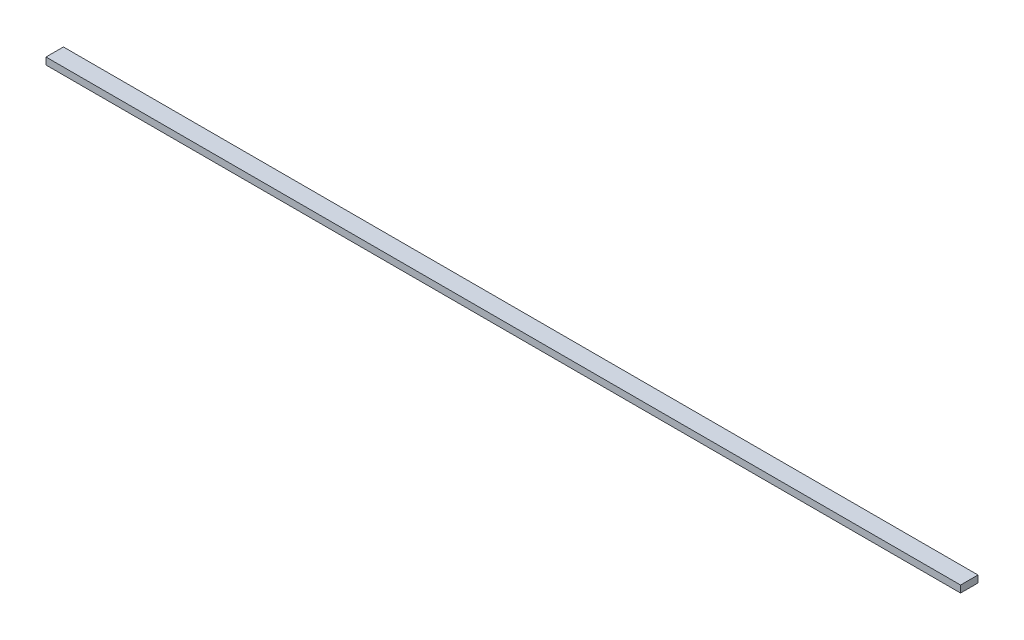
ISO-10303-21;
HEADER;
FILE_DESCRIPTION(('STEP AP214'),'2;1');
FILE_NAME('part.step','',(''),(''),'','','');
FILE_SCHEMA(('AUTOMOTIVE_DESIGN { 1 0 10303 214 1 1 1 1 }'));
ENDSEC;
DATA;
#1=APPLICATION_CONTEXT('core data for automotive mechanical design processes');
#2=APPLICATION_PROTOCOL_DEFINITION('international standard','automotive_design',2000,#1);
#3=PRODUCT_CONTEXT('',#1,'mechanical');
#4=PRODUCT('Part','Part','',(#3));
#5=PRODUCT_RELATED_PRODUCT_CATEGORY('part','',(#4));
#6=PRODUCT_DEFINITION_FORMATION('','',#4);
#7=PRODUCT_DEFINITION_CONTEXT('part definition',#1,'design');
#8=PRODUCT_DEFINITION('design','',#6,#7);
#9=PRODUCT_DEFINITION_SHAPE('','',#8);
#10=(LENGTH_UNIT() NAMED_UNIT(*) SI_UNIT(.MILLI.,.METRE.));
#11=(NAMED_UNIT(*) PLANE_ANGLE_UNIT() SI_UNIT($,.RADIAN.));
#12=(NAMED_UNIT(*) SI_UNIT($,.STERADIAN.) SOLID_ANGLE_UNIT());
#13=UNCERTAINTY_MEASURE_WITH_UNIT(LENGTH_MEASURE(1.E-05),#10,'distance_accuracy_value','');
#14=(GEOMETRIC_REPRESENTATION_CONTEXT(3) GLOBAL_UNCERTAINTY_ASSIGNED_CONTEXT((#13)) GLOBAL_UNIT_ASSIGNED_CONTEXT((#10,
#11,#12)) REPRESENTATION_CONTEXT('',''));
#15=CARTESIAN_POINT('',(0.,0.,0.));
#16=DIRECTION('',(0.,0.,1.));
#17=DIRECTION('',(1.,0.,0.));
#18=AXIS2_PLACEMENT_3D('',#15,#16,#17);
#19=CARTESIAN_POINT('',(10500.,0.,0.));
#20=DIRECTION('',(0.,0.,-1.));
#21=DIRECTION('',(0.,1.,0.));
#22=AXIS2_PLACEMENT_3D('',#19,#20,#21);
#23=PLANE('',#22);
#24=DIRECTION('',(0.,-1.,0.));
#25=VECTOR('',#24,1.);
#26=CARTESIAN_POINT('',(0.,0.,0.));
#27=LINE('',#26,#25);
#28=CARTESIAN_POINT('',(0.,0.,0.));
#29=VERTEX_POINT('',#28);
#30=CARTESIAN_POINT('',(0.,-80.,0.));
#31=VERTEX_POINT('',#30);
#32=EDGE_CURVE('E97',#29,#31,#27,.T.);
#33=ORIENTED_EDGE('',*,*,#32,.T.);
#34=DIRECTION('',(-1.,0.,0.));
#35=VECTOR('',#34,1.);
#36=CARTESIAN_POINT('',(10500.,-80.,0.));
#37=LINE('',#36,#35);
#38=CARTESIAN_POINT('',(10500.,-80.,0.));
#39=VERTEX_POINT('',#38);
#40=EDGE_CURVE('E11',#39,#31,#37,.T.);
#41=ORIENTED_EDGE('',*,*,#40,.F.);
#42=DIRECTION('',(0.,-1.,0.));
#43=VECTOR('',#42,1.);
#44=CARTESIAN_POINT('',(10500.,0.,0.));
#45=LINE('',#44,#43);
#46=CARTESIAN_POINT('',(10500.,0.,0.));
#47=VERTEX_POINT('',#46);
#48=EDGE_CURVE('E85',#47,#39,#45,.T.);
#49=ORIENTED_EDGE('',*,*,#48,.F.);
#50=DIRECTION('',(-1.,0.,0.));
#51=VECTOR('',#50,1.);
#52=CARTESIAN_POINT('',(10500.,0.,0.));
#53=LINE('',#52,#51);
#54=EDGE_CURVE('E93',#47,#29,#53,.T.);
#55=ORIENTED_EDGE('',*,*,#54,.T.);
#56=EDGE_LOOP('',(#33,#41,#49,#55));
#57=FACE_BOUND('',#56,.T.);
#58=ADVANCED_FACE('F34',(#57),#23,.F.);
#59=CARTESIAN_POINT('',(10500.,-80.,0.));
#60=DIRECTION('',(0.,1.,0.));
#61=DIRECTION('',(0.,0.,1.));
#62=AXIS2_PLACEMENT_3D('',#59,#60,#61);
#63=PLANE('',#62);
#64=DIRECTION('',(0.,0.,-1.));
#65=VECTOR('',#64,1.);
#66=CARTESIAN_POINT('',(0.,-80.,0.));
#67=LINE('',#66,#65);
#68=CARTESIAN_POINT('',(0.,-80.,-200.));
#69=VERTEX_POINT('',#68);
#70=EDGE_CURVE('E89',#31,#69,#67,.T.);
#71=ORIENTED_EDGE('',*,*,#70,.T.);
#72=DIRECTION('',(-1.,0.,0.));
#73=VECTOR('',#72,1.);
#74=CARTESIAN_POINT('',(10500.,-80.,-200.));
#75=LINE('',#74,#73);
#76=CARTESIAN_POINT('',(10500.,-80.,-200.));
#77=VERTEX_POINT('',#76);
#78=EDGE_CURVE('E42',#77,#69,#75,.T.);
#79=ORIENTED_EDGE('',*,*,#78,.F.);
#80=DIRECTION('',(0.,0.,-1.));
#81=VECTOR('',#80,1.);
#82=CARTESIAN_POINT('',(10500.,-80.,0.));
#83=LINE('',#82,#81);
#84=EDGE_CURVE('E80',#39,#77,#83,.T.);
#85=ORIENTED_EDGE('',*,*,#84,.F.);
#86=ORIENTED_EDGE('',*,*,#40,.T.);
#87=EDGE_LOOP('',(#71,#79,#85,#86));
#88=FACE_BOUND('',#87,.T.);
#89=ADVANCED_FACE('F88',(#88),#63,.F.);
#90=CARTESIAN_POINT('',(10500.,0.,-200.));
#91=DIRECTION('',(0.,0.,1.));
#92=DIRECTION('',(1.,0.,0.));
#93=AXIS2_PLACEMENT_3D('',#90,#91,#92);
#94=PLANE('',#93);
#95=DIRECTION('',(0.,1.,0.));
#96=VECTOR('',#95,1.);
#97=CARTESIAN_POINT('',(0.,0.,-200.));
#98=LINE('',#97,#96);
#99=CARTESIAN_POINT('',(0.,0.,-200.));
#100=VERTEX_POINT('',#99);
#101=EDGE_CURVE('E67',#69,#100,#98,.T.);
#102=ORIENTED_EDGE('',*,*,#101,.T.);
#103=DIRECTION('',(-1.,0.,0.));
#104=VECTOR('',#103,1.);
#105=CARTESIAN_POINT('',(10500.,0.,-200.));
#106=LINE('',#105,#104);
#107=CARTESIAN_POINT('',(10500.,0.,-200.));
#108=VERTEX_POINT('',#107);
#109=EDGE_CURVE('E90',#108,#100,#106,.T.);
#110=ORIENTED_EDGE('',*,*,#109,.F.);
#111=DIRECTION('',(0.,1.,0.));
#112=VECTOR('',#111,1.);
#113=CARTESIAN_POINT('',(10500.,0.,-200.));
#114=LINE('',#113,#112);
#115=EDGE_CURVE('E83',#77,#108,#114,.T.);
#116=ORIENTED_EDGE('',*,*,#115,.F.);
#117=ORIENTED_EDGE('',*,*,#78,.T.);
#118=EDGE_LOOP('',(#102,#110,#116,#117));
#119=FACE_BOUND('',#118,.T.);
#120=ADVANCED_FACE('F91',(#119),#94,.F.);
#121=CARTESIAN_POINT('',(10500.,0.,0.));
#122=DIRECTION('',(0.,-1.,0.));
#123=DIRECTION('',(0.,0.,-1.));
#124=AXIS2_PLACEMENT_3D('',#121,#122,#123);
#125=PLANE('',#124);
#126=DIRECTION('',(0.,0.,1.));
#127=VECTOR('',#126,1.);
#128=CARTESIAN_POINT('',(0.,0.,0.));
#129=LINE('',#128,#127);
#130=EDGE_CURVE('E73',#100,#29,#129,.T.);
#131=ORIENTED_EDGE('',*,*,#130,.T.);
#132=ORIENTED_EDGE('',*,*,#54,.F.);
#133=DIRECTION('',(0.,0.,1.));
#134=VECTOR('',#133,1.);
#135=CARTESIAN_POINT('',(10500.,0.,0.));
#136=LINE('',#135,#134);
#137=EDGE_CURVE('E50',#108,#47,#136,.T.);
#138=ORIENTED_EDGE('',*,*,#137,.F.);
#139=ORIENTED_EDGE('',*,*,#109,.T.);
#140=EDGE_LOOP('',(#131,#132,#138,#139));
#141=FACE_BOUND('',#140,.T.);
#142=ADVANCED_FACE('F104',(#141),#125,.F.);
#143=CARTESIAN_POINT('',(10500.,0.,0.));
#144=DIRECTION('',(1.,0.,0.));
#145=DIRECTION('',(0.,0.,-1.));
#146=AXIS2_PLACEMENT_3D('',#143,#144,#145);
#147=PLANE('',#146);
#148=ORIENTED_EDGE('',*,*,#48,.T.);
#149=ORIENTED_EDGE('',*,*,#84,.T.);
#150=ORIENTED_EDGE('',*,*,#115,.T.);
#151=ORIENTED_EDGE('',*,*,#137,.T.);
#152=EDGE_LOOP('',(#148,#149,#150,#151));
#153=FACE_BOUND('',#152,.T.);
#154=ADVANCED_FACE('F81',(#153),#147,.T.);
#155=CARTESIAN_POINT('',(0.,0.,0.));
#156=DIRECTION('',(1.,0.,0.));
#157=DIRECTION('',(0.,0.,-1.));
#158=AXIS2_PLACEMENT_3D('',#155,#156,#157);
#159=PLANE('',#158);
#160=ORIENTED_EDGE('',*,*,#32,.F.);
#161=ORIENTED_EDGE('',*,*,#130,.F.);
#162=ORIENTED_EDGE('',*,*,#101,.F.);
#163=ORIENTED_EDGE('',*,*,#70,.F.);
#164=EDGE_LOOP('',(#160,#161,#162,#163));
#165=FACE_BOUND('',#164,.T.);
#166=ADVANCED_FACE('F107',(#165),#159,.F.);
#167=CLOSED_SHELL('',(#58,#89,#120,#142,#154,#166));
#168=MANIFOLD_SOLID_BREP('B2',#167);
#169=ADVANCED_BREP_SHAPE_REPRESENTATION('',(#18,#168),#14);
#170=SHAPE_DEFINITION_REPRESENTATION(#9,#169);
ENDSEC;
END-ISO-10303-21;
